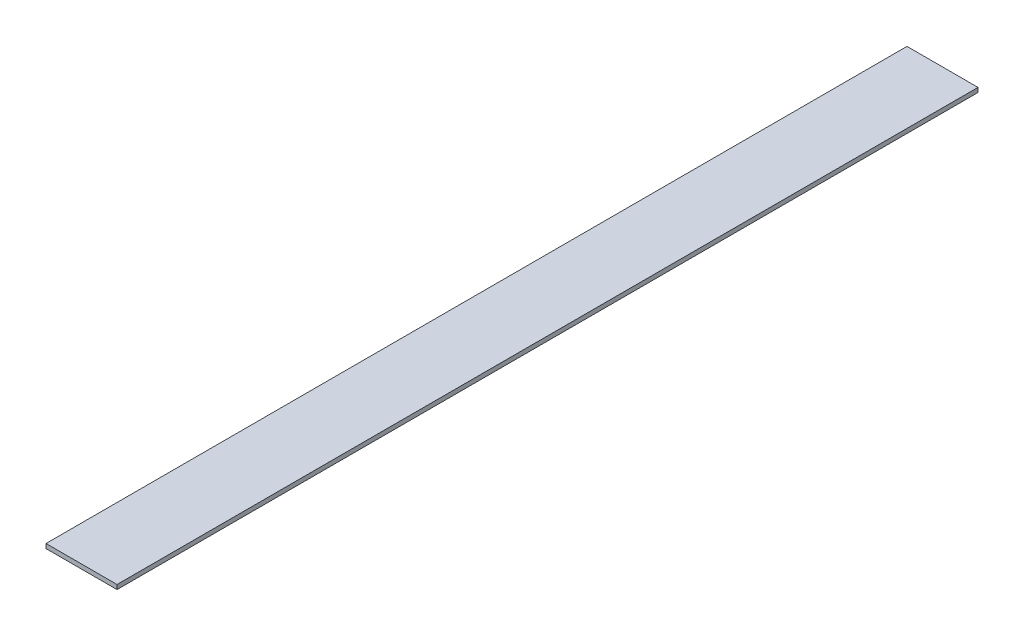
ISO-10303-21;
HEADER;
FILE_DESCRIPTION(('STEP AP214'),'2;1');
FILE_NAME('part.step','',(''),(''),'','','');
FILE_SCHEMA(('AUTOMOTIVE_DESIGN { 1 0 10303 214 1 1 1 1 }'));
ENDSEC;
DATA;
#1=APPLICATION_CONTEXT('core data for automotive mechanical design processes');
#2=APPLICATION_PROTOCOL_DEFINITION('international standard','automotive_design',2000,#1);
#3=PRODUCT_CONTEXT('',#1,'mechanical');
#4=PRODUCT('Part','Part','',(#3));
#5=PRODUCT_RELATED_PRODUCT_CATEGORY('part','',(#4));
#6=PRODUCT_DEFINITION_FORMATION('','',#4);
#7=PRODUCT_DEFINITION_CONTEXT('part definition',#1,'design');
#8=PRODUCT_DEFINITION('design','',#6,#7);
#9=PRODUCT_DEFINITION_SHAPE('','',#8);
#10=(LENGTH_UNIT() NAMED_UNIT(*) SI_UNIT(.MILLI.,.METRE.));
#11=(NAMED_UNIT(*) PLANE_ANGLE_UNIT() SI_UNIT($,.RADIAN.));
#12=(NAMED_UNIT(*) SI_UNIT($,.STERADIAN.) SOLID_ANGLE_UNIT());
#13=UNCERTAINTY_MEASURE_WITH_UNIT(LENGTH_MEASURE(1.E-05),#10,'distance_accuracy_value','');
#14=(GEOMETRIC_REPRESENTATION_CONTEXT(3) GLOBAL_UNCERTAINTY_ASSIGNED_CONTEXT((#13)) GLOBAL_UNIT_ASSIGNED_CONTEXT((#10,
#11,#12)) REPRESENTATION_CONTEXT('',''));
#15=CARTESIAN_POINT('',(0.,0.,0.));
#16=DIRECTION('',(0.,0.,1.));
#17=DIRECTION('',(1.,0.,0.));
#18=AXIS2_PLACEMENT_3D('',#15,#16,#17);
#19=CARTESIAN_POINT('',(25.4,3.175,307.975));
#20=DIRECTION('',(-1.,0.,0.));
#21=DIRECTION('',(0.,0.,1.));
#22=AXIS2_PLACEMENT_3D('',#19,#20,#21);
#23=PLANE('',#22);
#24=DIRECTION('',(0.,0.,-1.));
#25=VECTOR('',#24,1.);
#26=CARTESIAN_POINT('',(25.4,0.,307.975));
#27=LINE('',#26,#25);
#28=CARTESIAN_POINT('',(25.4,0.,307.975));
#29=VERTEX_POINT('',#28);
#30=CARTESIAN_POINT('',(25.4,0.,-307.975));
#31=VERTEX_POINT('',#30);
#32=EDGE_CURVE('E97',#29,#31,#27,.T.);
#33=ORIENTED_EDGE('',*,*,#32,.T.);
#34=DIRECTION('',(0.,-1.,0.));
#35=VECTOR('',#34,1.);
#36=CARTESIAN_POINT('',(25.4,3.175,-307.975));
#37=LINE('',#36,#35);
#38=CARTESIAN_POINT('',(25.4,3.175,-307.975));
#39=VERTEX_POINT('',#38);
#40=EDGE_CURVE('E11',#39,#31,#37,.T.);
#41=ORIENTED_EDGE('',*,*,#40,.F.);
#42=DIRECTION('',(0.,0.,-1.));
#43=VECTOR('',#42,1.);
#44=CARTESIAN_POINT('',(25.4,3.175,307.975));
#45=LINE('',#44,#43);
#46=CARTESIAN_POINT('',(25.4,3.175,307.975));
#47=VERTEX_POINT('',#46);
#48=EDGE_CURVE('E85',#47,#39,#45,.T.);
#49=ORIENTED_EDGE('',*,*,#48,.F.);
#50=DIRECTION('',(0.,-1.,0.));
#51=VECTOR('',#50,1.);
#52=CARTESIAN_POINT('',(25.4,3.175,307.975));
#53=LINE('',#52,#51);
#54=EDGE_CURVE('E93',#47,#29,#53,.T.);
#55=ORIENTED_EDGE('',*,*,#54,.T.);
#56=EDGE_LOOP('',(#33,#41,#49,#55));
#57=FACE_BOUND('',#56,.T.);
#58=ADVANCED_FACE('F34',(#57),#23,.F.);
#59=CARTESIAN_POINT('',(-25.4,3.175,-307.975));
#60=DIRECTION('',(0.,0.,1.));
#61=DIRECTION('',(1.,0.,0.));
#62=AXIS2_PLACEMENT_3D('',#59,#60,#61);
#63=PLANE('',#62);
#64=DIRECTION('',(-1.,0.,0.));
#65=VECTOR('',#64,1.);
#66=CARTESIAN_POINT('',(-25.4,0.,-307.975));
#67=LINE('',#66,#65);
#68=CARTESIAN_POINT('',(-25.4,0.,-307.975));
#69=VERTEX_POINT('',#68);
#70=EDGE_CURVE('E89',#31,#69,#67,.T.);
#71=ORIENTED_EDGE('',*,*,#70,.T.);
#72=DIRECTION('',(0.,-1.,0.));
#73=VECTOR('',#72,1.);
#74=CARTESIAN_POINT('',(-25.4,3.175,-307.975));
#75=LINE('',#74,#73);
#76=CARTESIAN_POINT('',(-25.4,3.175,-307.975));
#77=VERTEX_POINT('',#76);
#78=EDGE_CURVE('E42',#77,#69,#75,.T.);
#79=ORIENTED_EDGE('',*,*,#78,.F.);
#80=DIRECTION('',(-1.,0.,0.));
#81=VECTOR('',#80,1.);
#82=CARTESIAN_POINT('',(-25.4,3.175,-307.975));
#83=LINE('',#82,#81);
#84=EDGE_CURVE('E80',#39,#77,#83,.T.);
#85=ORIENTED_EDGE('',*,*,#84,.F.);
#86=ORIENTED_EDGE('',*,*,#40,.T.);
#87=EDGE_LOOP('',(#71,#79,#85,#86));
#88=FACE_BOUND('',#87,.T.);
#89=ADVANCED_FACE('F88',(#88),#63,.F.);
#90=CARTESIAN_POINT('',(-25.4,3.175,307.975));
#91=DIRECTION('',(1.,0.,0.));
#92=DIRECTION('',(0.,0.,-1.));
#93=AXIS2_PLACEMENT_3D('',#90,#91,#92);
#94=PLANE('',#93);
#95=DIRECTION('',(0.,0.,1.));
#96=VECTOR('',#95,1.);
#97=CARTESIAN_POINT('',(-25.4,0.,307.975));
#98=LINE('',#97,#96);
#99=CARTESIAN_POINT('',(-25.4,0.,307.975));
#100=VERTEX_POINT('',#99);
#101=EDGE_CURVE('E67',#69,#100,#98,.T.);
#102=ORIENTED_EDGE('',*,*,#101,.T.);
#103=DIRECTION('',(0.,-1.,0.));
#104=VECTOR('',#103,1.);
#105=CARTESIAN_POINT('',(-25.4,3.175,307.975));
#106=LINE('',#105,#104);
#107=CARTESIAN_POINT('',(-25.4,3.175,307.975));
#108=VERTEX_POINT('',#107);
#109=EDGE_CURVE('E90',#108,#100,#106,.T.);
#110=ORIENTED_EDGE('',*,*,#109,.F.);
#111=DIRECTION('',(0.,0.,1.));
#112=VECTOR('',#111,1.);
#113=CARTESIAN_POINT('',(-25.4,3.175,307.975));
#114=LINE('',#113,#112);
#115=EDGE_CURVE('E83',#77,#108,#114,.T.);
#116=ORIENTED_EDGE('',*,*,#115,.F.);
#117=ORIENTED_EDGE('',*,*,#78,.T.);
#118=EDGE_LOOP('',(#102,#110,#116,#117));
#119=FACE_BOUND('',#118,.T.);
#120=ADVANCED_FACE('F91',(#119),#94,.F.);
#121=CARTESIAN_POINT('',(-25.4,3.175,307.975));
#122=DIRECTION('',(0.,0.,-1.));
#123=DIRECTION('',(-1.,0.,0.));
#124=AXIS2_PLACEMENT_3D('',#121,#122,#123);
#125=PLANE('',#124);
#126=DIRECTION('',(1.,0.,0.));
#127=VECTOR('',#126,1.);
#128=CARTESIAN_POINT('',(-25.4,0.,307.975));
#129=LINE('',#128,#127);
#130=EDGE_CURVE('E73',#100,#29,#129,.T.);
#131=ORIENTED_EDGE('',*,*,#130,.T.);
#132=ORIENTED_EDGE('',*,*,#54,.F.);
#133=DIRECTION('',(1.,0.,0.));
#134=VECTOR('',#133,1.);
#135=CARTESIAN_POINT('',(-25.4,3.175,307.975));
#136=LINE('',#135,#134);
#137=EDGE_CURVE('E50',#108,#47,#136,.T.);
#138=ORIENTED_EDGE('',*,*,#137,.F.);
#139=ORIENTED_EDGE('',*,*,#109,.T.);
#140=EDGE_LOOP('',(#131,#132,#138,#139));
#141=FACE_BOUND('',#140,.T.);
#142=ADVANCED_FACE('F104',(#141),#125,.F.);
#143=CARTESIAN_POINT('',(0.,3.175,0.));
#144=DIRECTION('',(0.,-1.,0.));
#145=DIRECTION('',(0.,0.,-1.));
#146=AXIS2_PLACEMENT_3D('',#143,#144,#145);
#147=PLANE('',#146);
#148=ORIENTED_EDGE('',*,*,#48,.T.);
#149=ORIENTED_EDGE('',*,*,#84,.T.);
#150=ORIENTED_EDGE('',*,*,#115,.T.);
#151=ORIENTED_EDGE('',*,*,#137,.T.);
#152=EDGE_LOOP('',(#148,#149,#150,#151));
#153=FACE_BOUND('',#152,.T.);
#154=ADVANCED_FACE('F81',(#153),#147,.F.);
#155=CARTESIAN_POINT('',(0.,0.,0.));
#156=DIRECTION('',(0.,-1.,0.));
#157=DIRECTION('',(0.,0.,-1.));
#158=AXIS2_PLACEMENT_3D('',#155,#156,#157);
#159=PLANE('',#158);
#160=ORIENTED_EDGE('',*,*,#32,.F.);
#161=ORIENTED_EDGE('',*,*,#130,.F.);
#162=ORIENTED_EDGE('',*,*,#101,.F.);
#163=ORIENTED_EDGE('',*,*,#70,.F.);
#164=EDGE_LOOP('',(#160,#161,#162,#163));
#165=FACE_BOUND('',#164,.T.);
#166=ADVANCED_FACE('F107',(#165),#159,.T.);
#167=CLOSED_SHELL('',(#58,#89,#120,#142,#154,#166));
#168=MANIFOLD_SOLID_BREP('B2',#167);
#169=ADVANCED_BREP_SHAPE_REPRESENTATION('',(#18,#168),#14);
#170=SHAPE_DEFINITION_REPRESENTATION(#9,#169);
ENDSEC;
END-ISO-10303-21;
